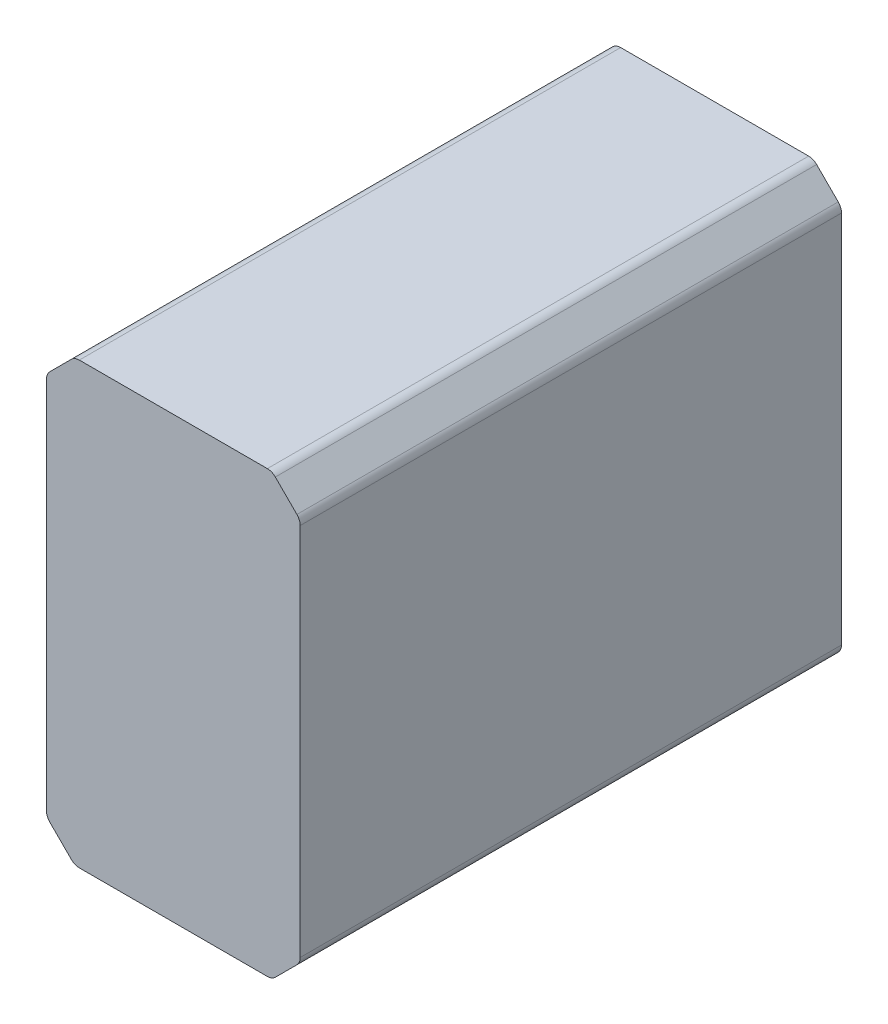
ISO-10303-21;
HEADER;
FILE_DESCRIPTION(('STEP AP214'),'2;1');
FILE_NAME('part.step','',(''),(''),'','','');
FILE_SCHEMA(('AUTOMOTIVE_DESIGN { 1 0 10303 214 1 1 1 1 }'));
ENDSEC;
DATA;
#1=APPLICATION_CONTEXT('core data for automotive mechanical design processes');
#2=APPLICATION_PROTOCOL_DEFINITION('international standard','automotive_design',2000,#1);
#3=PRODUCT_CONTEXT('',#1,'mechanical');
#4=PRODUCT('Part','Part','',(#3));
#5=PRODUCT_RELATED_PRODUCT_CATEGORY('part','',(#4));
#6=PRODUCT_DEFINITION_FORMATION('','',#4);
#7=PRODUCT_DEFINITION_CONTEXT('part definition',#1,'design');
#8=PRODUCT_DEFINITION('design','',#6,#7);
#9=PRODUCT_DEFINITION_SHAPE('','',#8);
#10=(LENGTH_UNIT() NAMED_UNIT(*) SI_UNIT(.MILLI.,.METRE.));
#11=(NAMED_UNIT(*) PLANE_ANGLE_UNIT() SI_UNIT($,.RADIAN.));
#12=(NAMED_UNIT(*) SI_UNIT($,.STERADIAN.) SOLID_ANGLE_UNIT());
#13=UNCERTAINTY_MEASURE_WITH_UNIT(LENGTH_MEASURE(1.E-05),#10,'distance_accuracy_value','');
#14=(GEOMETRIC_REPRESENTATION_CONTEXT(3) GLOBAL_UNCERTAINTY_ASSIGNED_CONTEXT((#13)) GLOBAL_UNIT_ASSIGNED_CONTEXT((#10,
#11,#12)) REPRESENTATION_CONTEXT('',''));
#15=CARTESIAN_POINT('',(0.,0.,0.));
#16=DIRECTION('',(0.,0.,1.));
#17=DIRECTION('',(1.,0.,0.));
#18=AXIS2_PLACEMENT_3D('',#15,#16,#17);
#19=CARTESIAN_POINT('',(0.,0.,192.));
#20=DIRECTION('',(1.,0.,0.));
#21=DIRECTION('',(0.,1.,0.));
#22=AXIS2_PLACEMENT_3D('',#19,#20,#21);
#23=PLANE('',#22);
#24=DIRECTION('',(0.,-1.,0.));
#25=VECTOR('',#24,1.);
#26=CARTESIAN_POINT('',(0.,0.,192.));
#27=LINE('',#26,#25);
#28=CARTESIAN_POINT('',(0.,-11.6568542494924,192.));
#29=VERTEX_POINT('',#28);
#30=CARTESIAN_POINT('',(0.,-144.343145750508,192.));
#31=VERTEX_POINT('',#30);
#32=EDGE_CURVE('E178',#29,#31,#27,.T.);
#33=ORIENTED_EDGE('',*,*,#32,.F.);
#34=DIRECTION('',(0.,0.,1.));
#35=VECTOR('',#34,1.);
#36=CARTESIAN_POINT('',(0.,-11.6568542494924,0.));
#37=LINE('',#36,#35);
#38=CARTESIAN_POINT('',(0.,-11.6568542494924,0.));
#39=VERTEX_POINT('',#38);
#40=EDGE_CURVE('E243',#29,#39,#37,.F.);
#41=ORIENTED_EDGE('',*,*,#40,.T.);
#42=DIRECTION('',(0.,-1.,0.));
#43=VECTOR('',#42,1.);
#44=CARTESIAN_POINT('',(0.,0.,0.));
#45=LINE('',#44,#43);
#46=CARTESIAN_POINT('',(0.,-144.343145750508,0.));
#47=VERTEX_POINT('',#46);
#48=EDGE_CURVE('E296',#39,#47,#45,.T.);
#49=ORIENTED_EDGE('',*,*,#48,.T.);
#50=DIRECTION('',(0.,0.,-1.));
#51=VECTOR('',#50,1.);
#52=CARTESIAN_POINT('',(0.,-144.343145750508,192.));
#53=LINE('',#52,#51);
#54=EDGE_CURVE('E240',#47,#31,#53,.F.);
#55=ORIENTED_EDGE('',*,*,#54,.T.);
#56=EDGE_LOOP('',(#33,#41,#49,#55));
#57=FACE_BOUND('',#56,.T.);
#58=ADVANCED_FACE('F39',(#57),#23,.F.);
#59=CARTESIAN_POINT('',(0.,-156.,192.));
#60=DIRECTION('',(0.,1.,0.));
#61=DIRECTION('',(0.,0.,1.));
#62=AXIS2_PLACEMENT_3D('',#59,#60,#61);
#63=PLANE('',#62);
#64=DIRECTION('',(1.,0.,0.));
#65=VECTOR('',#64,1.);
#66=CARTESIAN_POINT('',(0.,-156.,192.));
#67=LINE('',#66,#65);
#68=CARTESIAN_POINT('',(11.6568542494924,-156.,192.));
#69=VERTEX_POINT('',#68);
#70=CARTESIAN_POINT('',(78.3431457505075,-156.,192.));
#71=VERTEX_POINT('',#70);
#72=EDGE_CURVE('E182',#69,#71,#67,.T.);
#73=ORIENTED_EDGE('',*,*,#72,.F.);
#74=DIRECTION('',(0.,0.,1.));
#75=VECTOR('',#74,1.);
#76=CARTESIAN_POINT('',(11.6568542494924,-156.,0.));
#77=LINE('',#76,#75);
#78=CARTESIAN_POINT('',(11.6568542494924,-156.,0.));
#79=VERTEX_POINT('',#78);
#80=EDGE_CURVE('E249',#69,#79,#77,.F.);
#81=ORIENTED_EDGE('',*,*,#80,.T.);
#82=DIRECTION('',(1.,0.,0.));
#83=VECTOR('',#82,1.);
#84=CARTESIAN_POINT('',(0.,-156.,0.));
#85=LINE('',#84,#83);
#86=CARTESIAN_POINT('',(78.3431457505075,-156.,0.));
#87=VERTEX_POINT('',#86);
#88=EDGE_CURVE('E185',#79,#87,#85,.T.);
#89=ORIENTED_EDGE('',*,*,#88,.T.);
#90=DIRECTION('',(0.,0.,-1.));
#91=VECTOR('',#90,1.);
#92=CARTESIAN_POINT('',(78.3431457505076,-156.,192.));
#93=LINE('',#92,#91);
#94=EDGE_CURVE('E246',#87,#71,#93,.F.);
#95=ORIENTED_EDGE('',*,*,#94,.T.);
#96=EDGE_LOOP('',(#73,#81,#89,#95));
#97=FACE_BOUND('',#96,.T.);
#98=ADVANCED_FACE('F293',(#97),#63,.F.);
#99=CARTESIAN_POINT('',(90.,0.,192.));
#100=DIRECTION('',(-1.,0.,0.));
#101=DIRECTION('',(0.,-1.,0.));
#102=AXIS2_PLACEMENT_3D('',#99,#100,#101);
#103=PLANE('',#102);
#104=DIRECTION('',(0.,1.,0.));
#105=VECTOR('',#104,1.);
#106=CARTESIAN_POINT('',(90.,0.,192.));
#107=LINE('',#106,#105);
#108=CARTESIAN_POINT('',(90.,-144.343145750508,192.));
#109=VERTEX_POINT('',#108);
#110=CARTESIAN_POINT('',(90.,-11.6568542494924,192.));
#111=VERTEX_POINT('',#110);
#112=EDGE_CURVE('E272',#109,#111,#107,.T.);
#113=ORIENTED_EDGE('',*,*,#112,.F.);
#114=DIRECTION('',(0.,0.,1.));
#115=VECTOR('',#114,1.);
#116=CARTESIAN_POINT('',(90.,-144.343145750508,0.));
#117=LINE('',#116,#115);
#118=CARTESIAN_POINT('',(90.,-144.343145750508,0.));
#119=VERTEX_POINT('',#118);
#120=EDGE_CURVE('E262',#109,#119,#117,.F.);
#121=ORIENTED_EDGE('',*,*,#120,.T.);
#122=DIRECTION('',(0.,1.,0.));
#123=VECTOR('',#122,1.);
#124=CARTESIAN_POINT('',(90.,0.,0.));
#125=LINE('',#124,#123);
#126=CARTESIAN_POINT('',(90.,-11.6568542494924,0.));
#127=VERTEX_POINT('',#126);
#128=EDGE_CURVE('E179',#119,#127,#125,.T.);
#129=ORIENTED_EDGE('',*,*,#128,.T.);
#130=DIRECTION('',(0.,0.,-1.));
#131=VECTOR('',#130,1.);
#132=CARTESIAN_POINT('',(90.,-11.6568542494924,192.));
#133=LINE('',#132,#131);
#134=EDGE_CURVE('E259',#127,#111,#133,.F.);
#135=ORIENTED_EDGE('',*,*,#134,.T.);
#136=EDGE_LOOP('',(#113,#121,#129,#135));
#137=FACE_BOUND('',#136,.T.);
#138=ADVANCED_FACE('F278',(#137),#103,.F.);
#139=CARTESIAN_POINT('',(0.,0.,192.));
#140=DIRECTION('',(0.,-1.,0.));
#141=DIRECTION('',(0.,0.,-1.));
#142=AXIS2_PLACEMENT_3D('',#139,#140,#141);
#143=PLANE('',#142);
#144=DIRECTION('',(-1.,0.,0.));
#145=VECTOR('',#144,1.);
#146=CARTESIAN_POINT('',(0.,0.,0.));
#147=LINE('',#146,#145);
#148=CARTESIAN_POINT('',(78.3431457505076,0.,0.));
#149=VERTEX_POINT('',#148);
#150=CARTESIAN_POINT('',(11.6568542494924,0.,0.));
#151=VERTEX_POINT('',#150);
#152=EDGE_CURVE('E167',#149,#151,#147,.T.);
#153=ORIENTED_EDGE('',*,*,#152,.T.);
#154=DIRECTION('',(0.,0.,-1.));
#155=VECTOR('',#154,1.);
#156=CARTESIAN_POINT('',(11.6568542494924,0.,192.));
#157=LINE('',#156,#155);
#158=CARTESIAN_POINT('',(11.6568542494924,0.,192.));
#159=VERTEX_POINT('',#158);
#160=EDGE_CURVE('E171',#151,#159,#157,.F.);
#161=ORIENTED_EDGE('',*,*,#160,.T.);
#162=DIRECTION('',(-1.,0.,0.));
#163=VECTOR('',#162,1.);
#164=CARTESIAN_POINT('',(0.,0.,192.));
#165=LINE('',#164,#163);
#166=CARTESIAN_POINT('',(78.3431457505076,0.,192.));
#167=VERTEX_POINT('',#166);
#168=EDGE_CURVE('E170',#167,#159,#165,.T.);
#169=ORIENTED_EDGE('',*,*,#168,.F.);
#170=DIRECTION('',(0.,0.,1.));
#171=VECTOR('',#170,1.);
#172=CARTESIAN_POINT('',(78.3431457505076,0.,0.));
#173=LINE('',#172,#171);
#174=EDGE_CURVE('E155',#167,#149,#173,.F.);
#175=ORIENTED_EDGE('',*,*,#174,.T.);
#176=EDGE_LOOP('',(#153,#161,#169,#175));
#177=FACE_BOUND('',#176,.T.);
#178=ADVANCED_FACE('F165',(#177),#143,.F.);
#179=CARTESIAN_POINT('',(0.,0.,192.));
#180=DIRECTION('',(0.,0.,1.));
#181=DIRECTION('',(1.,0.,0.));
#182=AXIS2_PLACEMENT_3D('',#179,#180,#181);
#183=PLANE('',#182);
#184=ORIENTED_EDGE('',*,*,#168,.T.);
#185=CARTESIAN_POINT('',(11.6568542494924,-4.,192.));
#186=DIRECTION('',(0.,0.,1.));
#187=DIRECTION('',(1.,0.,0.));
#188=AXIS2_PLACEMENT_3D('',#185,#186,#187);
#189=CIRCLE('',#188,4.);
#190=CARTESIAN_POINT('',(8.8284271247462,-1.17157287525381,192.));
#191=VERTEX_POINT('',#190);
#192=EDGE_CURVE('E224',#159,#191,#189,.T.);
#193=ORIENTED_EDGE('',*,*,#192,.T.);
#194=DIRECTION('',(0.707106781186549,0.707106781186547,0.));
#195=VECTOR('',#194,1.);
#196=CARTESIAN_POINT('',(4.99999999999999,-5.00000000000001,192.));
#197=LINE('',#196,#195);
#198=CARTESIAN_POINT('',(1.17157287525381,-8.82842712474617,192.));
#199=VERTEX_POINT('',#198);
#200=EDGE_CURVE('E201',#191,#199,#197,.F.);
#201=ORIENTED_EDGE('',*,*,#200,.T.);
#202=CARTESIAN_POINT('',(4.,-11.6568542494924,192.));
#203=DIRECTION('',(0.,0.,1.));
#204=DIRECTION('',(1.,0.,0.));
#205=AXIS2_PLACEMENT_3D('',#202,#203,#204);
#206=CIRCLE('',#205,4.);
#207=EDGE_CURVE('E222',#199,#29,#206,.T.);
#208=ORIENTED_EDGE('',*,*,#207,.T.);
#209=ORIENTED_EDGE('',*,*,#32,.T.);
#210=CARTESIAN_POINT('',(4.00000000000002,-144.343145750508,192.));
#211=DIRECTION('',(0.,0.,1.));
#212=DIRECTION('',(1.,0.,0.));
#213=AXIS2_PLACEMENT_3D('',#210,#211,#212);
#214=CIRCLE('',#213,4.);
#215=CARTESIAN_POINT('',(1.17157287525382,-147.171572875254,192.));
#216=VERTEX_POINT('',#215);
#217=EDGE_CURVE('E218',#31,#216,#214,.T.);
#218=ORIENTED_EDGE('',*,*,#217,.T.);
#219=DIRECTION('',(-0.707106781186547,0.707106781186549,0.));
#220=VECTOR('',#219,1.);
#221=CARTESIAN_POINT('',(-73.,-72.9999999999997,192.));
#222=LINE('',#221,#220);
#223=CARTESIAN_POINT('',(8.82842712474626,-154.828427124746,192.));
#224=VERTEX_POINT('',#223);
#225=EDGE_CURVE('E172',#216,#224,#222,.F.);
#226=ORIENTED_EDGE('',*,*,#225,.T.);
#227=CARTESIAN_POINT('',(11.6568542494924,-152.,192.));
#228=DIRECTION('',(0.,0.,1.));
#229=DIRECTION('',(1.,0.,0.));
#230=AXIS2_PLACEMENT_3D('',#227,#228,#229);
#231=CIRCLE('',#230,4.);
#232=EDGE_CURVE('E220',#224,#69,#231,.T.);
#233=ORIENTED_EDGE('',*,*,#232,.T.);
#234=ORIENTED_EDGE('',*,*,#72,.T.);
#235=CARTESIAN_POINT('',(78.3431457505076,-152.,192.));
#236=DIRECTION('',(0.,0.,1.));
#237=DIRECTION('',(1.,0.,0.));
#238=AXIS2_PLACEMENT_3D('',#235,#236,#237);
#239=CIRCLE('',#238,4.);
#240=CARTESIAN_POINT('',(81.1715728752538,-154.828427124746,192.));
#241=VERTEX_POINT('',#240);
#242=EDGE_CURVE('E216',#71,#241,#239,.T.);
#243=ORIENTED_EDGE('',*,*,#242,.T.);
#244=DIRECTION('',(-0.707106781186549,-0.707106781186546,0.));
#245=VECTOR('',#244,1.);
#246=CARTESIAN_POINT('',(118.,-118.,192.));
#247=LINE('',#246,#245);
#248=CARTESIAN_POINT('',(88.8284271247462,-147.171572875254,192.));
#249=VERTEX_POINT('',#248);
#250=EDGE_CURVE('E204',#241,#249,#247,.F.);
#251=ORIENTED_EDGE('',*,*,#250,.T.);
#252=CARTESIAN_POINT('',(86.,-144.343145750508,192.));
#253=DIRECTION('',(0.,0.,1.));
#254=DIRECTION('',(1.,0.,0.));
#255=AXIS2_PLACEMENT_3D('',#252,#253,#254);
#256=CIRCLE('',#255,4.);
#257=EDGE_CURVE('E214',#249,#109,#256,.T.);
#258=ORIENTED_EDGE('',*,*,#257,.T.);
#259=ORIENTED_EDGE('',*,*,#112,.T.);
#260=CARTESIAN_POINT('',(86.,-11.6568542494924,192.));
#261=DIRECTION('',(0.,0.,1.));
#262=DIRECTION('',(1.,0.,0.));
#263=AXIS2_PLACEMENT_3D('',#260,#261,#262);
#264=CIRCLE('',#263,4.);
#265=CARTESIAN_POINT('',(88.8284271247462,-8.82842712474621,192.));
#266=VERTEX_POINT('',#265);
#267=EDGE_CURVE('E212',#111,#266,#264,.T.);
#268=ORIENTED_EDGE('',*,*,#267,.T.);
#269=DIRECTION('',(0.707106781186548,-0.707106781186548,0.));
#270=VECTOR('',#269,1.);
#271=CARTESIAN_POINT('',(40.,40.,192.));
#272=LINE('',#271,#270);
#273=CARTESIAN_POINT('',(81.1715728752538,-1.17157287525382,192.));
#274=VERTEX_POINT('',#273);
#275=EDGE_CURVE('E198',#266,#274,#272,.F.);
#276=ORIENTED_EDGE('',*,*,#275,.T.);
#277=CARTESIAN_POINT('',(78.3431457505076,-4.,192.));
#278=DIRECTION('',(0.,0.,1.));
#279=DIRECTION('',(1.,0.,0.));
#280=AXIS2_PLACEMENT_3D('',#277,#278,#279);
#281=CIRCLE('',#280,4.);
#282=EDGE_CURVE('E210',#274,#167,#281,.T.);
#283=ORIENTED_EDGE('',*,*,#282,.T.);
#284=EDGE_LOOP('',(#184,#193,#201,#208,#209,#218,#226,#233,#234,#243,#251,#258,#259,#268,#276,#283));
#285=FACE_BOUND('',#284,.T.);
#286=ADVANCED_FACE('F269',(#285),#183,.T.);
#287=CARTESIAN_POINT('',(0.,0.,0.));
#288=DIRECTION('',(0.,0.,1.));
#289=DIRECTION('',(1.,0.,0.));
#290=AXIS2_PLACEMENT_3D('',#287,#288,#289);
#291=PLANE('',#290);
#292=DIRECTION('',(-0.707106781186549,-0.707106781186547,0.));
#293=VECTOR('',#292,1.);
#294=CARTESIAN_POINT('',(0.,-9.99999999999998,0.));
#295=LINE('',#294,#293);
#296=CARTESIAN_POINT('',(1.17157287525382,-8.82842712474617,0.));
#297=VERTEX_POINT('',#296);
#298=CARTESIAN_POINT('',(8.8284271247462,-1.17157287525381,0.));
#299=VERTEX_POINT('',#298);
#300=EDGE_CURVE('E191',#297,#299,#295,.F.);
#301=ORIENTED_EDGE('',*,*,#300,.T.);
#302=CARTESIAN_POINT('',(11.6568542494924,-4.,0.));
#303=DIRECTION('',(0.,0.,1.));
#304=DIRECTION('',(1.,0.,0.));
#305=AXIS2_PLACEMENT_3D('',#302,#303,#304);
#306=CIRCLE('',#305,4.);
#307=EDGE_CURVE('E177',#299,#151,#306,.F.);
#308=ORIENTED_EDGE('',*,*,#307,.T.);
#309=ORIENTED_EDGE('',*,*,#152,.F.);
#310=CARTESIAN_POINT('',(78.3431457505076,-4.,0.));
#311=DIRECTION('',(0.,0.,1.));
#312=DIRECTION('',(1.,0.,0.));
#313=AXIS2_PLACEMENT_3D('',#310,#311,#312);
#314=CIRCLE('',#313,4.);
#315=CARTESIAN_POINT('',(81.1715728752538,-1.17157287525381,0.));
#316=VERTEX_POINT('',#315);
#317=EDGE_CURVE('E152',#149,#316,#314,.F.);
#318=ORIENTED_EDGE('',*,*,#317,.T.);
#319=DIRECTION('',(-0.707106781186548,0.707106781186548,0.));
#320=VECTOR('',#319,1.);
#321=CARTESIAN_POINT('',(80.,0.,0.));
#322=LINE('',#321,#320);
#323=CARTESIAN_POINT('',(88.8284271247462,-8.8284271247462,0.));
#324=VERTEX_POINT('',#323);
#325=EDGE_CURVE('E189',#316,#324,#322,.F.);
#326=ORIENTED_EDGE('',*,*,#325,.T.);
#327=CARTESIAN_POINT('',(86.,-11.6568542494924,0.));
#328=DIRECTION('',(0.,0.,1.));
#329=DIRECTION('',(1.,0.,0.));
#330=AXIS2_PLACEMENT_3D('',#327,#328,#329);
#331=CIRCLE('',#330,4.);
#332=EDGE_CURVE('E159',#324,#127,#331,.F.);
#333=ORIENTED_EDGE('',*,*,#332,.T.);
#334=ORIENTED_EDGE('',*,*,#128,.F.);
#335=CARTESIAN_POINT('',(86.,-144.343145750508,0.));
#336=DIRECTION('',(0.,0.,1.));
#337=DIRECTION('',(1.,0.,0.));
#338=AXIS2_PLACEMENT_3D('',#335,#336,#337);
#339=CIRCLE('',#338,4.);
#340=CARTESIAN_POINT('',(88.8284271247462,-147.171572875254,0.));
#341=VERTEX_POINT('',#340);
#342=EDGE_CURVE('E61',#119,#341,#339,.F.);
#343=ORIENTED_EDGE('',*,*,#342,.T.);
#344=DIRECTION('',(0.707106781186549,0.707106781186546,0.));
#345=VECTOR('',#344,1.);
#346=CARTESIAN_POINT('',(90.,-146.,0.));
#347=LINE('',#346,#345);
#348=CARTESIAN_POINT('',(81.1715728752538,-154.828427124746,0.));
#349=VERTEX_POINT('',#348);
#350=EDGE_CURVE('E193',#341,#349,#347,.F.);
#351=ORIENTED_EDGE('',*,*,#350,.T.);
#352=CARTESIAN_POINT('',(78.3431457505076,-152.,0.));
#353=DIRECTION('',(0.,0.,1.));
#354=DIRECTION('',(1.,0.,0.));
#355=AXIS2_PLACEMENT_3D('',#352,#353,#354);
#356=CIRCLE('',#355,4.);
#357=EDGE_CURVE('E231',#349,#87,#356,.F.);
#358=ORIENTED_EDGE('',*,*,#357,.T.);
#359=ORIENTED_EDGE('',*,*,#88,.F.);
#360=CARTESIAN_POINT('',(11.6568542494924,-152.,0.));
#361=DIRECTION('',(0.,0.,1.));
#362=DIRECTION('',(1.,0.,0.));
#363=AXIS2_PLACEMENT_3D('',#360,#361,#362);
#364=CIRCLE('',#363,4.);
#365=CARTESIAN_POINT('',(8.82842712474623,-154.828427124746,0.));
#366=VERTEX_POINT('',#365);
#367=EDGE_CURVE('E235',#79,#366,#364,.F.);
#368=ORIENTED_EDGE('',*,*,#367,.T.);
#369=DIRECTION('',(0.707106781186547,-0.707106781186549,0.));
#370=VECTOR('',#369,1.);
#371=CARTESIAN_POINT('',(10.0000000000001,-156.,0.));
#372=LINE('',#371,#370);
#373=CARTESIAN_POINT('',(1.17157287525381,-147.171572875254,0.));
#374=VERTEX_POINT('',#373);
#375=EDGE_CURVE('E195',#366,#374,#372,.F.);
#376=ORIENTED_EDGE('',*,*,#375,.T.);
#377=CARTESIAN_POINT('',(4.00000000000002,-144.343145750508,0.));
#378=DIRECTION('',(0.,0.,1.));
#379=DIRECTION('',(1.,0.,0.));
#380=AXIS2_PLACEMENT_3D('',#377,#378,#379);
#381=CIRCLE('',#380,4.);
#382=EDGE_CURVE('E233',#374,#47,#381,.F.);
#383=ORIENTED_EDGE('',*,*,#382,.T.);
#384=ORIENTED_EDGE('',*,*,#48,.F.);
#385=CARTESIAN_POINT('',(4.,-11.6568542494924,0.));
#386=DIRECTION('',(0.,0.,1.));
#387=DIRECTION('',(1.,0.,0.));
#388=AXIS2_PLACEMENT_3D('',#385,#386,#387);
#389=CIRCLE('',#388,4.);
#390=EDGE_CURVE('E237',#39,#297,#389,.F.);
#391=ORIENTED_EDGE('',*,*,#390,.T.);
#392=EDGE_LOOP('',(#301,#308,#309,#318,#326,#333,#334,#343,#351,#358,#359,#368,#376,#383,#384,#391));
#393=FACE_BOUND('',#392,.T.);
#394=ADVANCED_FACE('F175',(#393),#291,.F.);
#395=CARTESIAN_POINT('',(10.0000000000001,-156.,192.));
#396=DIRECTION('',(0.707106781186548,0.707106781186546,0.));
#397=DIRECTION('',(0.,0.,-1.));
#398=AXIS2_PLACEMENT_3D('',#395,#396,#397);
#399=PLANE('',#398);
#400=ORIENTED_EDGE('',*,*,#375,.F.);
#401=DIRECTION('',(0.,0.,-1.));
#402=VECTOR('',#401,1.);
#403=CARTESIAN_POINT('',(8.82842712474624,-154.828427124746,192.));
#404=LINE('',#403,#402);
#405=EDGE_CURVE('E254',#366,#224,#404,.F.);
#406=ORIENTED_EDGE('',*,*,#405,.T.);
#407=ORIENTED_EDGE('',*,*,#225,.F.);
#408=DIRECTION('',(0.,0.,1.));
#409=VECTOR('',#408,1.);
#410=CARTESIAN_POINT('',(1.17157287525382,-147.171572875254,0.));
#411=LINE('',#410,#409);
#412=EDGE_CURVE('E252',#216,#374,#411,.F.);
#413=ORIENTED_EDGE('',*,*,#412,.T.);
#414=EDGE_LOOP('',(#400,#406,#407,#413));
#415=FACE_BOUND('',#414,.T.);
#416=ADVANCED_FACE('F333',(#415),#399,.F.);
#417=CARTESIAN_POINT('',(90.,-146.,192.));
#418=DIRECTION('',(-0.707106781186545,0.707106781186549,0.));
#419=DIRECTION('',(0.,0.,-1.));
#420=AXIS2_PLACEMENT_3D('',#417,#418,#419);
#421=PLANE('',#420);
#422=ORIENTED_EDGE('',*,*,#250,.F.);
#423=DIRECTION('',(0.,0.,1.));
#424=VECTOR('',#423,1.);
#425=CARTESIAN_POINT('',(81.1715728752538,-154.828427124746,0.));
#426=LINE('',#425,#424);
#427=EDGE_CURVE('E54',#241,#349,#426,.F.);
#428=ORIENTED_EDGE('',*,*,#427,.T.);
#429=ORIENTED_EDGE('',*,*,#350,.F.);
#430=DIRECTION('',(0.,0.,-1.));
#431=VECTOR('',#430,1.);
#432=CARTESIAN_POINT('',(88.8284271247462,-147.171572875254,192.));
#433=LINE('',#432,#431);
#434=EDGE_CURVE('E256',#341,#249,#433,.F.);
#435=ORIENTED_EDGE('',*,*,#434,.T.);
#436=EDGE_LOOP('',(#422,#428,#429,#435));
#437=FACE_BOUND('',#436,.T.);
#438=ADVANCED_FACE('F284',(#437),#421,.F.);
#439=CARTESIAN_POINT('',(0.,-9.99999999999998,192.));
#440=DIRECTION('',(0.707106781186546,-0.707106781186548,0.));
#441=DIRECTION('',(0.,0.,-1.));
#442=AXIS2_PLACEMENT_3D('',#439,#440,#441);
#443=PLANE('',#442);
#444=ORIENTED_EDGE('',*,*,#200,.F.);
#445=DIRECTION('',(0.,0.,1.));
#446=VECTOR('',#445,1.);
#447=CARTESIAN_POINT('',(8.8284271247462,-1.17157287525381,0.));
#448=LINE('',#447,#446);
#449=EDGE_CURVE('E160',#191,#299,#448,.F.);
#450=ORIENTED_EDGE('',*,*,#449,.T.);
#451=ORIENTED_EDGE('',*,*,#300,.F.);
#452=DIRECTION('',(0.,0.,-1.));
#453=VECTOR('',#452,1.);
#454=CARTESIAN_POINT('',(1.17157287525382,-8.82842712474617,192.));
#455=LINE('',#454,#453);
#456=EDGE_CURVE('E226',#297,#199,#455,.F.);
#457=ORIENTED_EDGE('',*,*,#456,.T.);
#458=EDGE_LOOP('',(#444,#450,#451,#457));
#459=FACE_BOUND('',#458,.T.);
#460=ADVANCED_FACE('F307',(#459),#443,.F.);
#461=CARTESIAN_POINT('',(80.,0.,192.));
#462=DIRECTION('',(-0.707106781186547,-0.707106781186547,0.));
#463=DIRECTION('',(0.,0.,-1.));
#464=AXIS2_PLACEMENT_3D('',#461,#462,#463);
#465=PLANE('',#464);
#466=ORIENTED_EDGE('',*,*,#275,.F.);
#467=DIRECTION('',(0.,0.,1.));
#468=VECTOR('',#467,1.);
#469=CARTESIAN_POINT('',(88.8284271247462,-8.8284271247462,0.));
#470=LINE('',#469,#468);
#471=EDGE_CURVE('E11',#266,#324,#470,.F.);
#472=ORIENTED_EDGE('',*,*,#471,.T.);
#473=ORIENTED_EDGE('',*,*,#325,.F.);
#474=DIRECTION('',(0.,0.,-1.));
#475=VECTOR('',#474,1.);
#476=CARTESIAN_POINT('',(81.1715728752538,-1.17157287525381,192.));
#477=LINE('',#476,#475);
#478=EDGE_CURVE('E47',#316,#274,#477,.F.);
#479=ORIENTED_EDGE('',*,*,#478,.T.);
#480=EDGE_LOOP('',(#466,#472,#473,#479));
#481=FACE_BOUND('',#480,.T.);
#482=ADVANCED_FACE('F266',(#481),#465,.F.);
#483=CARTESIAN_POINT('',(11.6568542494924,-4.,192.));
#484=DIRECTION('',(0.,0.,1.));
#485=DIRECTION('',(1.,0.,0.));
#486=AXIS2_PLACEMENT_3D('',#483,#484,#485);
#487=CYLINDRICAL_SURFACE('',#486,4.);
#488=ORIENTED_EDGE('',*,*,#307,.F.);
#489=ORIENTED_EDGE('',*,*,#449,.F.);
#490=ORIENTED_EDGE('',*,*,#192,.F.);
#491=ORIENTED_EDGE('',*,*,#160,.F.);
#492=EDGE_LOOP('',(#488,#489,#490,#491));
#493=FACE_BOUND('',#492,.T.);
#494=ADVANCED_FACE('F310',(#493),#487,.T.);
#495=CARTESIAN_POINT('',(4.,-11.6568542494924,192.));
#496=DIRECTION('',(0.,0.,-1.));
#497=DIRECTION('',(-1.,0.,0.));
#498=AXIS2_PLACEMENT_3D('',#495,#496,#497);
#499=CYLINDRICAL_SURFACE('',#498,4.);
#500=ORIENTED_EDGE('',*,*,#207,.F.);
#501=ORIENTED_EDGE('',*,*,#456,.F.);
#502=ORIENTED_EDGE('',*,*,#390,.F.);
#503=ORIENTED_EDGE('',*,*,#40,.F.);
#504=EDGE_LOOP('',(#500,#501,#502,#503));
#505=FACE_BOUND('',#504,.T.);
#506=ADVANCED_FACE('F312',(#505),#499,.T.);
#507=CARTESIAN_POINT('',(11.6568542494924,-152.,192.));
#508=DIRECTION('',(0.,0.,-1.));
#509=DIRECTION('',(-1.,0.,0.));
#510=AXIS2_PLACEMENT_3D('',#507,#508,#509);
#511=CYLINDRICAL_SURFACE('',#510,4.);
#512=ORIENTED_EDGE('',*,*,#232,.F.);
#513=ORIENTED_EDGE('',*,*,#405,.F.);
#514=ORIENTED_EDGE('',*,*,#367,.F.);
#515=ORIENTED_EDGE('',*,*,#80,.F.);
#516=EDGE_LOOP('',(#512,#513,#514,#515));
#517=FACE_BOUND('',#516,.T.);
#518=ADVANCED_FACE('F318',(#517),#511,.T.);
#519=CARTESIAN_POINT('',(4.00000000000002,-144.343145750508,192.));
#520=DIRECTION('',(0.,0.,1.));
#521=DIRECTION('',(1.,0.,0.));
#522=AXIS2_PLACEMENT_3D('',#519,#520,#521);
#523=CYLINDRICAL_SURFACE('',#522,4.);
#524=ORIENTED_EDGE('',*,*,#382,.F.);
#525=ORIENTED_EDGE('',*,*,#412,.F.);
#526=ORIENTED_EDGE('',*,*,#217,.F.);
#527=ORIENTED_EDGE('',*,*,#54,.F.);
#528=EDGE_LOOP('',(#524,#525,#526,#527));
#529=FACE_BOUND('',#528,.T.);
#530=ADVANCED_FACE('F378',(#529),#523,.T.);
#531=CARTESIAN_POINT('',(78.3431457505076,-152.,192.));
#532=DIRECTION('',(0.,0.,1.));
#533=DIRECTION('',(1.,0.,0.));
#534=AXIS2_PLACEMENT_3D('',#531,#532,#533);
#535=CYLINDRICAL_SURFACE('',#534,4.);
#536=ORIENTED_EDGE('',*,*,#357,.F.);
#537=ORIENTED_EDGE('',*,*,#427,.F.);
#538=ORIENTED_EDGE('',*,*,#242,.F.);
#539=ORIENTED_EDGE('',*,*,#94,.F.);
#540=EDGE_LOOP('',(#536,#537,#538,#539));
#541=FACE_BOUND('',#540,.T.);
#542=ADVANCED_FACE('F290',(#541),#535,.T.);
#543=CARTESIAN_POINT('',(86.,-144.343145750508,192.));
#544=DIRECTION('',(0.,0.,-1.));
#545=DIRECTION('',(-1.,0.,0.));
#546=AXIS2_PLACEMENT_3D('',#543,#544,#545);
#547=CYLINDRICAL_SURFACE('',#546,4.);
#548=ORIENTED_EDGE('',*,*,#257,.F.);
#549=ORIENTED_EDGE('',*,*,#434,.F.);
#550=ORIENTED_EDGE('',*,*,#342,.F.);
#551=ORIENTED_EDGE('',*,*,#120,.F.);
#552=EDGE_LOOP('',(#548,#549,#550,#551));
#553=FACE_BOUND('',#552,.T.);
#554=ADVANCED_FACE('F282',(#553),#547,.T.);
#555=CARTESIAN_POINT('',(86.,-11.6568542494924,192.));
#556=DIRECTION('',(0.,0.,1.));
#557=DIRECTION('',(1.,0.,0.));
#558=AXIS2_PLACEMENT_3D('',#555,#556,#557);
#559=CYLINDRICAL_SURFACE('',#558,4.);
#560=ORIENTED_EDGE('',*,*,#332,.F.);
#561=ORIENTED_EDGE('',*,*,#471,.F.);
#562=ORIENTED_EDGE('',*,*,#267,.F.);
#563=ORIENTED_EDGE('',*,*,#134,.F.);
#564=EDGE_LOOP('',(#560,#561,#562,#563));
#565=FACE_BOUND('',#564,.T.);
#566=ADVANCED_FACE('F276',(#565),#559,.T.);
#567=CARTESIAN_POINT('',(78.3431457505076,-4.,192.));
#568=DIRECTION('',(0.,0.,-1.));
#569=DIRECTION('',(-1.,0.,0.));
#570=AXIS2_PLACEMENT_3D('',#567,#568,#569);
#571=CYLINDRICAL_SURFACE('',#570,4.);
#572=ORIENTED_EDGE('',*,*,#282,.F.);
#573=ORIENTED_EDGE('',*,*,#478,.F.);
#574=ORIENTED_EDGE('',*,*,#317,.F.);
#575=ORIENTED_EDGE('',*,*,#174,.F.);
#576=EDGE_LOOP('',(#572,#573,#574,#575));
#577=FACE_BOUND('',#576,.T.);
#578=ADVANCED_FACE('F41',(#577),#571,.T.);
#579=CLOSED_SHELL('',(#58,#98,#138,#178,#286,#394,#416,#438,#460,#482,#494,#506,#518,#530,#542,
#554,#566,#578));
#580=MANIFOLD_SOLID_BREP('B2',#579);
#581=ADVANCED_BREP_SHAPE_REPRESENTATION('',(#18,#580),#14);
#582=SHAPE_DEFINITION_REPRESENTATION(#9,#581);
ENDSEC;
END-ISO-10303-21;
